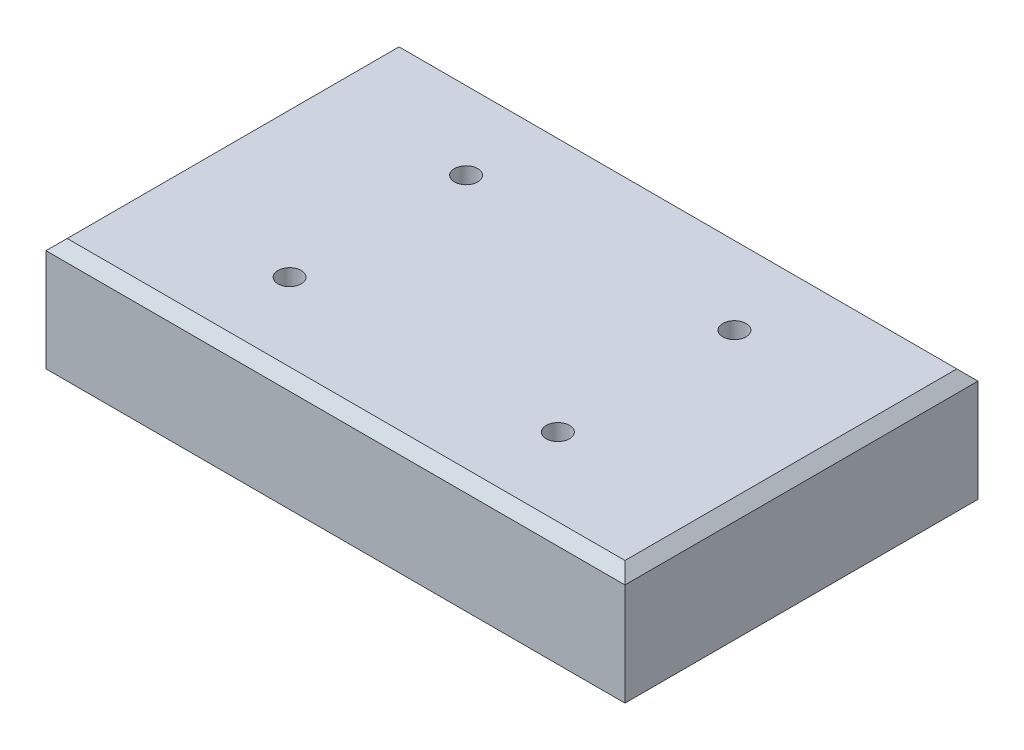
ISO-10303-21;
HEADER;
FILE_DESCRIPTION(('STEP AP214'),'2;1');
FILE_NAME('part.step','',(''),(''),'','','');
FILE_SCHEMA(('AUTOMOTIVE_DESIGN { 1 0 10303 214 1 1 1 1 }'));
ENDSEC;
DATA;
#1=APPLICATION_CONTEXT('core data for automotive mechanical design processes');
#2=APPLICATION_PROTOCOL_DEFINITION('international standard','automotive_design',2000,#1);
#3=PRODUCT_CONTEXT('',#1,'mechanical');
#4=PRODUCT('Part','Part','',(#3));
#5=PRODUCT_RELATED_PRODUCT_CATEGORY('part','',(#4));
#6=PRODUCT_DEFINITION_FORMATION('','',#4);
#7=PRODUCT_DEFINITION_CONTEXT('part definition',#1,'design');
#8=PRODUCT_DEFINITION('design','',#6,#7);
#9=PRODUCT_DEFINITION_SHAPE('','',#8);
#10=(LENGTH_UNIT() NAMED_UNIT(*) SI_UNIT(.MILLI.,.METRE.));
#11=(NAMED_UNIT(*) PLANE_ANGLE_UNIT() SI_UNIT($,.RADIAN.));
#12=(NAMED_UNIT(*) SI_UNIT($,.STERADIAN.) SOLID_ANGLE_UNIT());
#13=UNCERTAINTY_MEASURE_WITH_UNIT(LENGTH_MEASURE(1.E-05),#10,'distance_accuracy_value','');
#14=(GEOMETRIC_REPRESENTATION_CONTEXT(3) GLOBAL_UNCERTAINTY_ASSIGNED_CONTEXT((#13)) GLOBAL_UNIT_ASSIGNED_CONTEXT((#10,
#11,#12)) REPRESENTATION_CONTEXT('',''));
#15=CARTESIAN_POINT('',(0.,0.,0.));
#16=DIRECTION('',(0.,0.,1.));
#17=DIRECTION('',(1.,0.,0.));
#18=AXIS2_PLACEMENT_3D('',#15,#16,#17);
#19=CARTESIAN_POINT('',(-41.,16.,25.));
#20=DIRECTION('',(1.,0.,0.));
#21=DIRECTION('',(0.,0.,-1.));
#22=AXIS2_PLACEMENT_3D('',#19,#20,#21);
#23=PLANE('',#22);
#24=DIRECTION('',(0.,-1.,0.));
#25=VECTOR('',#24,1.);
#26=CARTESIAN_POINT('',(-41.,16.,25.));
#27=LINE('',#26,#25);
#28=CARTESIAN_POINT('',(-41.,14.5,25.));
#29=VERTEX_POINT('',#28);
#30=CARTESIAN_POINT('',(-41.,0.,25.));
#31=VERTEX_POINT('',#30);
#32=EDGE_CURVE('E162',#29,#31,#27,.T.);
#33=ORIENTED_EDGE('',*,*,#32,.F.);
#34=DIRECTION('',(0.,0.,-1.));
#35=VECTOR('',#34,1.);
#36=CARTESIAN_POINT('',(-41.,14.5,-25.));
#37=LINE('',#36,#35);
#38=CARTESIAN_POINT('',(-41.,14.5,-25.));
#39=VERTEX_POINT('',#38);
#40=EDGE_CURVE('E11',#29,#39,#37,.T.);
#41=ORIENTED_EDGE('',*,*,#40,.T.);
#42=DIRECTION('',(0.,-1.,0.));
#43=VECTOR('',#42,1.);
#44=CARTESIAN_POINT('',(-41.,16.,-25.));
#45=LINE('',#44,#43);
#46=CARTESIAN_POINT('',(-41.,0.,-25.));
#47=VERTEX_POINT('',#46);
#48=EDGE_CURVE('E156',#39,#47,#45,.T.);
#49=ORIENTED_EDGE('',*,*,#48,.T.);
#50=DIRECTION('',(0.,0.,1.));
#51=VECTOR('',#50,1.);
#52=CARTESIAN_POINT('',(-41.,0.,25.));
#53=LINE('',#52,#51);
#54=EDGE_CURVE('E144',#47,#31,#53,.T.);
#55=ORIENTED_EDGE('',*,*,#54,.T.);
#56=EDGE_LOOP('',(#33,#41,#49,#55));
#57=FACE_BOUND('',#56,.T.);
#58=ADVANCED_FACE('F45',(#57),#23,.F.);
#59=CARTESIAN_POINT('',(41.,16.,25.));
#60=DIRECTION('',(0.,0.,-1.));
#61=DIRECTION('',(-1.,0.,0.));
#62=AXIS2_PLACEMENT_3D('',#59,#60,#61);
#63=PLANE('',#62);
#64=DIRECTION('',(0.,-1.,0.));
#65=VECTOR('',#64,1.);
#66=CARTESIAN_POINT('',(41.,16.,25.));
#67=LINE('',#66,#65);
#68=CARTESIAN_POINT('',(41.,14.5,25.));
#69=VERTEX_POINT('',#68);
#70=CARTESIAN_POINT('',(41.,0.,25.));
#71=VERTEX_POINT('',#70);
#72=EDGE_CURVE('E160',#69,#71,#67,.T.);
#73=ORIENTED_EDGE('',*,*,#72,.F.);
#74=DIRECTION('',(-1.,0.,0.));
#75=VECTOR('',#74,1.);
#76=CARTESIAN_POINT('',(-41.,14.5,25.));
#77=LINE('',#76,#75);
#78=EDGE_CURVE('E55',#69,#29,#77,.T.);
#79=ORIENTED_EDGE('',*,*,#78,.T.);
#80=ORIENTED_EDGE('',*,*,#32,.T.);
#81=DIRECTION('',(1.,0.,0.));
#82=VECTOR('',#81,1.);
#83=CARTESIAN_POINT('',(41.,0.,25.));
#84=LINE('',#83,#82);
#85=EDGE_CURVE('E147',#31,#71,#84,.T.);
#86=ORIENTED_EDGE('',*,*,#85,.T.);
#87=EDGE_LOOP('',(#73,#79,#80,#86));
#88=FACE_BOUND('',#87,.T.);
#89=ADVANCED_FACE('F224',(#88),#63,.F.);
#90=CARTESIAN_POINT('',(41.,16.,25.));
#91=DIRECTION('',(-1.,0.,0.));
#92=DIRECTION('',(0.,0.,1.));
#93=AXIS2_PLACEMENT_3D('',#90,#91,#92);
#94=PLANE('',#93);
#95=DIRECTION('',(0.,-1.,0.));
#96=VECTOR('',#95,1.);
#97=CARTESIAN_POINT('',(41.,16.,-25.));
#98=LINE('',#97,#96);
#99=CARTESIAN_POINT('',(41.,14.5,-25.));
#100=VERTEX_POINT('',#99);
#101=CARTESIAN_POINT('',(41.,0.,-25.));
#102=VERTEX_POINT('',#101);
#103=EDGE_CURVE('E158',#100,#102,#98,.T.);
#104=ORIENTED_EDGE('',*,*,#103,.F.);
#105=DIRECTION('',(0.,0.,1.));
#106=VECTOR('',#105,1.);
#107=CARTESIAN_POINT('',(41.,14.5,25.));
#108=LINE('',#107,#106);
#109=EDGE_CURVE('E70',#100,#69,#108,.T.);
#110=ORIENTED_EDGE('',*,*,#109,.T.);
#111=ORIENTED_EDGE('',*,*,#72,.T.);
#112=DIRECTION('',(0.,0.,-1.));
#113=VECTOR('',#112,1.);
#114=CARTESIAN_POINT('',(41.,0.,25.));
#115=LINE('',#114,#113);
#116=EDGE_CURVE('E150',#71,#102,#115,.T.);
#117=ORIENTED_EDGE('',*,*,#116,.T.);
#118=EDGE_LOOP('',(#104,#110,#111,#117));
#119=FACE_BOUND('',#118,.T.);
#120=ADVANCED_FACE('F218',(#119),#94,.F.);
#121=CARTESIAN_POINT('',(41.,16.,-25.));
#122=DIRECTION('',(0.,0.,1.));
#123=DIRECTION('',(1.,0.,0.));
#124=AXIS2_PLACEMENT_3D('',#121,#122,#123);
#125=PLANE('',#124);
#126=ORIENTED_EDGE('',*,*,#48,.F.);
#127=DIRECTION('',(1.,0.,0.));
#128=VECTOR('',#127,1.);
#129=CARTESIAN_POINT('',(41.,14.5,-25.));
#130=LINE('',#129,#128);
#131=EDGE_CURVE('E173',#39,#100,#130,.T.);
#132=ORIENTED_EDGE('',*,*,#131,.T.);
#133=ORIENTED_EDGE('',*,*,#103,.T.);
#134=DIRECTION('',(-1.,0.,0.));
#135=VECTOR('',#134,1.);
#136=CARTESIAN_POINT('',(41.,0.,-25.));
#137=LINE('',#136,#135);
#138=EDGE_CURVE('E153',#102,#47,#137,.T.);
#139=ORIENTED_EDGE('',*,*,#138,.T.);
#140=EDGE_LOOP('',(#126,#132,#133,#139));
#141=FACE_BOUND('',#140,.T.);
#142=ADVANCED_FACE('F200',(#141),#125,.F.);
#143=CARTESIAN_POINT('',(0.,16.,0.));
#144=DIRECTION('',(0.,1.,0.));
#145=DIRECTION('',(0.,0.,1.));
#146=AXIS2_PLACEMENT_3D('',#143,#144,#145);
#147=PLANE('',#146);
#148=CARTESIAN_POINT('',(-19.,16.,-12.5));
#149=DIRECTION('',(0.,1.,0.));
#150=DIRECTION('',(0.,0.,1.));
#151=AXIS2_PLACEMENT_3D('',#148,#149,#150);
#152=CIRCLE('',#151,1.65);
#153=CARTESIAN_POINT('',(-19.,16.,-10.85));
#154=VERTEX_POINT('',#153);
#155=EDGE_CURVE('E121',#154,#154,#152,.T.);
#156=ORIENTED_EDGE('',*,*,#155,.F.);
#157=EDGE_LOOP('',(#156));
#158=FACE_BOUND('',#157,.T.);
#159=CARTESIAN_POINT('',(19.,16.,-12.5));
#160=DIRECTION('',(0.,1.,0.));
#161=DIRECTION('',(0.,0.,1.));
#162=AXIS2_PLACEMENT_3D('',#159,#160,#161);
#163=CIRCLE('',#162,1.65);
#164=CARTESIAN_POINT('',(19.,16.,-10.85));
#165=VERTEX_POINT('',#164);
#166=EDGE_CURVE('E120',#165,#165,#163,.T.);
#167=ORIENTED_EDGE('',*,*,#166,.F.);
#168=EDGE_LOOP('',(#167));
#169=FACE_BOUND('',#168,.T.);
#170=CARTESIAN_POINT('',(19.,16.,12.5));
#171=DIRECTION('',(0.,1.,0.));
#172=DIRECTION('',(0.,0.,1.));
#173=AXIS2_PLACEMENT_3D('',#170,#171,#172);
#174=CIRCLE('',#173,1.65);
#175=CARTESIAN_POINT('',(19.,16.,14.15));
#176=VERTEX_POINT('',#175);
#177=EDGE_CURVE('E131',#176,#176,#174,.T.);
#178=ORIENTED_EDGE('',*,*,#177,.F.);
#179=EDGE_LOOP('',(#178));
#180=FACE_BOUND('',#179,.T.);
#181=CARTESIAN_POINT('',(-19.,16.,12.5));
#182=DIRECTION('',(0.,1.,0.));
#183=DIRECTION('',(0.,0.,1.));
#184=AXIS2_PLACEMENT_3D('',#181,#182,#183);
#185=CIRCLE('',#184,1.65);
#186=CARTESIAN_POINT('',(-19.,16.,14.15));
#187=VERTEX_POINT('',#186);
#188=EDGE_CURVE('E137',#187,#187,#185,.T.);
#189=ORIENTED_EDGE('',*,*,#188,.F.);
#190=EDGE_LOOP('',(#189));
#191=FACE_BOUND('',#190,.T.);
#192=DIRECTION('',(0.,0.,-1.));
#193=VECTOR('',#192,1.);
#194=CARTESIAN_POINT('',(39.5,16.,-25.));
#195=LINE('',#194,#193);
#196=CARTESIAN_POINT('',(39.5,16.,23.5));
#197=VERTEX_POINT('',#196);
#198=CARTESIAN_POINT('',(39.5,16.,-23.5));
#199=VERTEX_POINT('',#198);
#200=EDGE_CURVE('E168',#197,#199,#195,.T.);
#201=ORIENTED_EDGE('',*,*,#200,.T.);
#202=DIRECTION('',(-1.,0.,0.));
#203=VECTOR('',#202,1.);
#204=CARTESIAN_POINT('',(-41.,16.,-23.5));
#205=LINE('',#204,#203);
#206=CARTESIAN_POINT('',(-39.5,16.,-23.5));
#207=VERTEX_POINT('',#206);
#208=EDGE_CURVE('E170',#199,#207,#205,.T.);
#209=ORIENTED_EDGE('',*,*,#208,.T.);
#210=DIRECTION('',(0.,0.,1.));
#211=VECTOR('',#210,1.);
#212=CARTESIAN_POINT('',(-39.5,16.,25.));
#213=LINE('',#212,#211);
#214=CARTESIAN_POINT('',(-39.5,16.,23.5));
#215=VERTEX_POINT('',#214);
#216=EDGE_CURVE('E164',#207,#215,#213,.T.);
#217=ORIENTED_EDGE('',*,*,#216,.T.);
#218=DIRECTION('',(1.,0.,0.));
#219=VECTOR('',#218,1.);
#220=CARTESIAN_POINT('',(41.,16.,23.5));
#221=LINE('',#220,#219);
#222=EDGE_CURVE('E166',#215,#197,#221,.T.);
#223=ORIENTED_EDGE('',*,*,#222,.T.);
#224=EDGE_LOOP('',(#201,#209,#217,#223));
#225=FACE_BOUND('',#224,.T.);
#226=ADVANCED_FACE('F207',(#158,#169,#180,#191,#225),#147,.T.);
#227=CARTESIAN_POINT('',(0.,0.,0.));
#228=DIRECTION('',(0.,1.,0.));
#229=DIRECTION('',(0.,0.,1.));
#230=AXIS2_PLACEMENT_3D('',#227,#228,#229);
#231=PLANE('',#230);
#232=ORIENTED_EDGE('',*,*,#54,.F.);
#233=ORIENTED_EDGE('',*,*,#138,.F.);
#234=ORIENTED_EDGE('',*,*,#116,.F.);
#235=ORIENTED_EDGE('',*,*,#85,.F.);
#236=EDGE_LOOP('',(#232,#233,#234,#235));
#237=FACE_BOUND('',#236,.T.);
#238=ADVANCED_FACE('F209',(#237),#231,.F.);
#239=CARTESIAN_POINT('',(0.,16.,23.5));
#240=DIRECTION('',(0.,0.707106781186544,0.707106781186551));
#241=DIRECTION('',(-1.,0.,0.));
#242=AXIS2_PLACEMENT_3D('',#239,#240,#241);
#243=PLANE('',#242);
#244=DIRECTION('',(0.577350269189624,0.577350269189629,-0.577350269189624));
#245=VECTOR('',#244,1.);
#246=CARTESIAN_POINT('',(-31.6666666666667,23.8333333333334,15.6666666666667));
#247=LINE('',#246,#245);
#248=EDGE_CURVE('E180',#29,#215,#247,.T.);
#249=ORIENTED_EDGE('',*,*,#248,.F.);
#250=ORIENTED_EDGE('',*,*,#78,.F.);
#251=DIRECTION('',(-0.577350269189624,0.577350269189629,-0.577350269189624));
#252=VECTOR('',#251,1.);
#253=CARTESIAN_POINT('',(26.3333333333334,29.1666666666667,10.3333333333334));
#254=LINE('',#253,#252);
#255=EDGE_CURVE('E50',#197,#69,#254,.F.);
#256=ORIENTED_EDGE('',*,*,#255,.F.);
#257=ORIENTED_EDGE('',*,*,#222,.F.);
#258=EDGE_LOOP('',(#249,#250,#256,#257));
#259=FACE_BOUND('',#258,.T.);
#260=ADVANCED_FACE('F48',(#259),#243,.T.);
#261=CARTESIAN_POINT('',(39.5,16.,0.));
#262=DIRECTION('',(0.707106781186551,0.707106781186544,0.));
#263=DIRECTION('',(0.,0.,1.));
#264=AXIS2_PLACEMENT_3D('',#261,#262,#263);
#265=PLANE('',#264);
#266=ORIENTED_EDGE('',*,*,#255,.T.);
#267=ORIENTED_EDGE('',*,*,#109,.F.);
#268=DIRECTION('',(-0.577350269189624,0.577350269189629,0.577350269189624));
#269=VECTOR('',#268,1.);
#270=CARTESIAN_POINT('',(31.6666666666667,23.8333333333334,-15.6666666666667));
#271=LINE('',#270,#269);
#272=EDGE_CURVE('E179',#199,#100,#271,.F.);
#273=ORIENTED_EDGE('',*,*,#272,.F.);
#274=ORIENTED_EDGE('',*,*,#200,.F.);
#275=EDGE_LOOP('',(#266,#267,#273,#274));
#276=FACE_BOUND('',#275,.T.);
#277=ADVANCED_FACE('F190',(#276),#265,.T.);
#278=CARTESIAN_POINT('',(-39.5,16.,0.));
#279=DIRECTION('',(-0.707106781186551,0.707106781186544,0.));
#280=DIRECTION('',(0.,0.,-1.));
#281=AXIS2_PLACEMENT_3D('',#278,#279,#280);
#282=PLANE('',#281);
#283=ORIENTED_EDGE('',*,*,#248,.T.);
#284=ORIENTED_EDGE('',*,*,#216,.F.);
#285=DIRECTION('',(-0.577350269189624,-0.577350269189629,-0.577350269189624));
#286=VECTOR('',#285,1.);
#287=CARTESIAN_POINT('',(-31.6666666666667,23.8333333333334,-15.6666666666667));
#288=LINE('',#287,#286);
#289=EDGE_CURVE('E143',#39,#207,#288,.F.);
#290=ORIENTED_EDGE('',*,*,#289,.F.);
#291=ORIENTED_EDGE('',*,*,#40,.F.);
#292=EDGE_LOOP('',(#283,#284,#290,#291));
#293=FACE_BOUND('',#292,.T.);
#294=ADVANCED_FACE('F195',(#293),#282,.T.);
#295=CARTESIAN_POINT('',(0.,16.,-23.5));
#296=DIRECTION('',(0.,0.707106781186544,-0.707106781186551));
#297=DIRECTION('',(1.,0.,0.));
#298=AXIS2_PLACEMENT_3D('',#295,#296,#297);
#299=PLANE('',#298);
#300=ORIENTED_EDGE('',*,*,#272,.T.);
#301=ORIENTED_EDGE('',*,*,#131,.F.);
#302=ORIENTED_EDGE('',*,*,#289,.T.);
#303=ORIENTED_EDGE('',*,*,#208,.F.);
#304=EDGE_LOOP('',(#300,#301,#302,#303));
#305=FACE_BOUND('',#304,.T.);
#306=ADVANCED_FACE('F204',(#305),#299,.T.);
#307=CARTESIAN_POINT('',(-19.,8.,12.5));
#308=DIRECTION('',(0.,1.,0.));
#309=DIRECTION('',(0.,0.,1.));
#310=AXIS2_PLACEMENT_3D('',#307,#308,#309);
#311=CONICAL_SURFACE('',#310,1.65,1.02974425867665);
#312=CARTESIAN_POINT('',(-19.,7.00857997860452,12.5));
#313=VERTEX_POINT('',#312);
#314=VERTEX_LOOP('',#313);
#315=FACE_BOUND('',#314,.T.);
#316=CARTESIAN_POINT('',(-19.,8.,12.5));
#317=DIRECTION('',(0.,1.,0.));
#318=DIRECTION('',(0.,0.,1.));
#319=AXIS2_PLACEMENT_3D('',#316,#317,#318);
#320=CIRCLE('',#319,1.65);
#321=CARTESIAN_POINT('',(-19.,8.,14.15));
#322=VERTEX_POINT('',#321);
#323=EDGE_CURVE('E140',#322,#322,#320,.T.);
#324=ORIENTED_EDGE('',*,*,#323,.T.);
#325=EDGE_LOOP('',(#324));
#326=FACE_BOUND('',#325,.T.);
#327=ADVANCED_FACE('F238',(#315,#326),#311,.F.);
#328=CARTESIAN_POINT('',(-19.,16.,12.5));
#329=DIRECTION('',(0.,1.,0.));
#330=DIRECTION('',(0.,0.,1.));
#331=AXIS2_PLACEMENT_3D('',#328,#329,#330);
#332=CYLINDRICAL_SURFACE('',#331,1.65);
#333=ORIENTED_EDGE('',*,*,#323,.F.);
#334=EDGE_LOOP('',(#333));
#335=FACE_BOUND('',#334,.T.);
#336=ORIENTED_EDGE('',*,*,#188,.T.);
#337=EDGE_LOOP('',(#336));
#338=FACE_BOUND('',#337,.T.);
#339=ADVANCED_FACE('F300',(#335,#338),#332,.F.);
#340=CARTESIAN_POINT('',(19.,8.,12.5));
#341=DIRECTION('',(0.,1.,0.));
#342=DIRECTION('',(0.,0.,1.));
#343=AXIS2_PLACEMENT_3D('',#340,#341,#342);
#344=CONICAL_SURFACE('',#343,1.65,1.02974425867665);
#345=CARTESIAN_POINT('',(19.,7.00857997860452,12.5));
#346=VERTEX_POINT('',#345);
#347=VERTEX_LOOP('',#346);
#348=FACE_BOUND('',#347,.T.);
#349=CARTESIAN_POINT('',(19.,8.,12.5));
#350=DIRECTION('',(0.,1.,0.));
#351=DIRECTION('',(0.,0.,1.));
#352=AXIS2_PLACEMENT_3D('',#349,#350,#351);
#353=CIRCLE('',#352,1.65);
#354=CARTESIAN_POINT('',(19.,8.,14.15));
#355=VERTEX_POINT('',#354);
#356=EDGE_CURVE('E134',#355,#355,#353,.T.);
#357=ORIENTED_EDGE('',*,*,#356,.T.);
#358=EDGE_LOOP('',(#357));
#359=FACE_BOUND('',#358,.T.);
#360=ADVANCED_FACE('F310',(#348,#359),#344,.F.);
#361=CARTESIAN_POINT('',(19.,16.,12.5));
#362=DIRECTION('',(0.,1.,0.));
#363=DIRECTION('',(0.,0.,1.));
#364=AXIS2_PLACEMENT_3D('',#361,#362,#363);
#365=CYLINDRICAL_SURFACE('',#364,1.65);
#366=ORIENTED_EDGE('',*,*,#356,.F.);
#367=EDGE_LOOP('',(#366));
#368=FACE_BOUND('',#367,.T.);
#369=ORIENTED_EDGE('',*,*,#177,.T.);
#370=EDGE_LOOP('',(#369));
#371=FACE_BOUND('',#370,.T.);
#372=ADVANCED_FACE('F322',(#368,#371),#365,.F.);
#373=CARTESIAN_POINT('',(19.,8.,-12.5));
#374=DIRECTION('',(0.,1.,0.));
#375=DIRECTION('',(0.,0.,1.));
#376=AXIS2_PLACEMENT_3D('',#373,#374,#375);
#377=CONICAL_SURFACE('',#376,1.65,1.02974425867665);
#378=CARTESIAN_POINT('',(19.,7.00857997860452,-12.5));
#379=VERTEX_POINT('',#378);
#380=VERTEX_LOOP('',#379);
#381=FACE_BOUND('',#380,.T.);
#382=CARTESIAN_POINT('',(19.,8.,-12.5));
#383=DIRECTION('',(0.,1.,0.));
#384=DIRECTION('',(0.,0.,1.));
#385=AXIS2_PLACEMENT_3D('',#382,#383,#384);
#386=CIRCLE('',#385,1.65);
#387=CARTESIAN_POINT('',(19.,8.,-10.85));
#388=VERTEX_POINT('',#387);
#389=EDGE_CURVE('E124',#388,#388,#386,.T.);
#390=ORIENTED_EDGE('',*,*,#389,.T.);
#391=EDGE_LOOP('',(#390));
#392=FACE_BOUND('',#391,.T.);
#393=ADVANCED_FACE('F332',(#381,#392),#377,.F.);
#394=CARTESIAN_POINT('',(19.,16.,-12.5));
#395=DIRECTION('',(0.,1.,0.));
#396=DIRECTION('',(0.,0.,1.));
#397=AXIS2_PLACEMENT_3D('',#394,#395,#396);
#398=CYLINDRICAL_SURFACE('',#397,1.65);
#399=ORIENTED_EDGE('',*,*,#389,.F.);
#400=EDGE_LOOP('',(#399));
#401=FACE_BOUND('',#400,.T.);
#402=ORIENTED_EDGE('',*,*,#166,.T.);
#403=EDGE_LOOP('',(#402));
#404=FACE_BOUND('',#403,.T.);
#405=ADVANCED_FACE('F114',(#401,#404),#398,.F.);
#406=CARTESIAN_POINT('',(-19.,8.,-12.5));
#407=DIRECTION('',(0.,1.,0.));
#408=DIRECTION('',(0.,0.,1.));
#409=AXIS2_PLACEMENT_3D('',#406,#407,#408);
#410=CONICAL_SURFACE('',#409,1.65,1.02974425867665);
#411=CARTESIAN_POINT('',(-19.,7.00857997860452,-12.5));
#412=VERTEX_POINT('',#411);
#413=VERTEX_LOOP('',#412);
#414=FACE_BOUND('',#413,.T.);
#415=CARTESIAN_POINT('',(-19.,8.,-12.5));
#416=DIRECTION('',(0.,1.,0.));
#417=DIRECTION('',(0.,0.,1.));
#418=AXIS2_PLACEMENT_3D('',#415,#416,#417);
#419=CIRCLE('',#418,1.65);
#420=CARTESIAN_POINT('',(-19.,8.,-10.85));
#421=VERTEX_POINT('',#420);
#422=EDGE_CURVE('E118',#421,#421,#419,.T.);
#423=ORIENTED_EDGE('',*,*,#422,.T.);
#424=EDGE_LOOP('',(#423));
#425=FACE_BOUND('',#424,.T.);
#426=ADVANCED_FACE('F110',(#414,#425),#410,.F.);
#427=CARTESIAN_POINT('',(-19.,16.,-12.5));
#428=DIRECTION('',(0.,1.,0.));
#429=DIRECTION('',(0.,0.,1.));
#430=AXIS2_PLACEMENT_3D('',#427,#428,#429);
#431=CYLINDRICAL_SURFACE('',#430,1.65);
#432=ORIENTED_EDGE('',*,*,#422,.F.);
#433=EDGE_LOOP('',(#432));
#434=FACE_BOUND('',#433,.T.);
#435=ORIENTED_EDGE('',*,*,#155,.T.);
#436=EDGE_LOOP('',(#435));
#437=FACE_BOUND('',#436,.T.);
#438=ADVANCED_FACE('F113',(#434,#437),#431,.F.);
#439=CLOSED_SHELL('',(#58,#89,#120,#142,#226,#238,#260,#277,#294,#306,#327,#339,#360,#372,#393,
#405,#426,#438));
#440=MANIFOLD_SOLID_BREP('B2',#439);
#441=ADVANCED_BREP_SHAPE_REPRESENTATION('',(#18,#440),#14);
#442=SHAPE_DEFINITION_REPRESENTATION(#9,#441);
ENDSEC;
END-ISO-10303-21;
